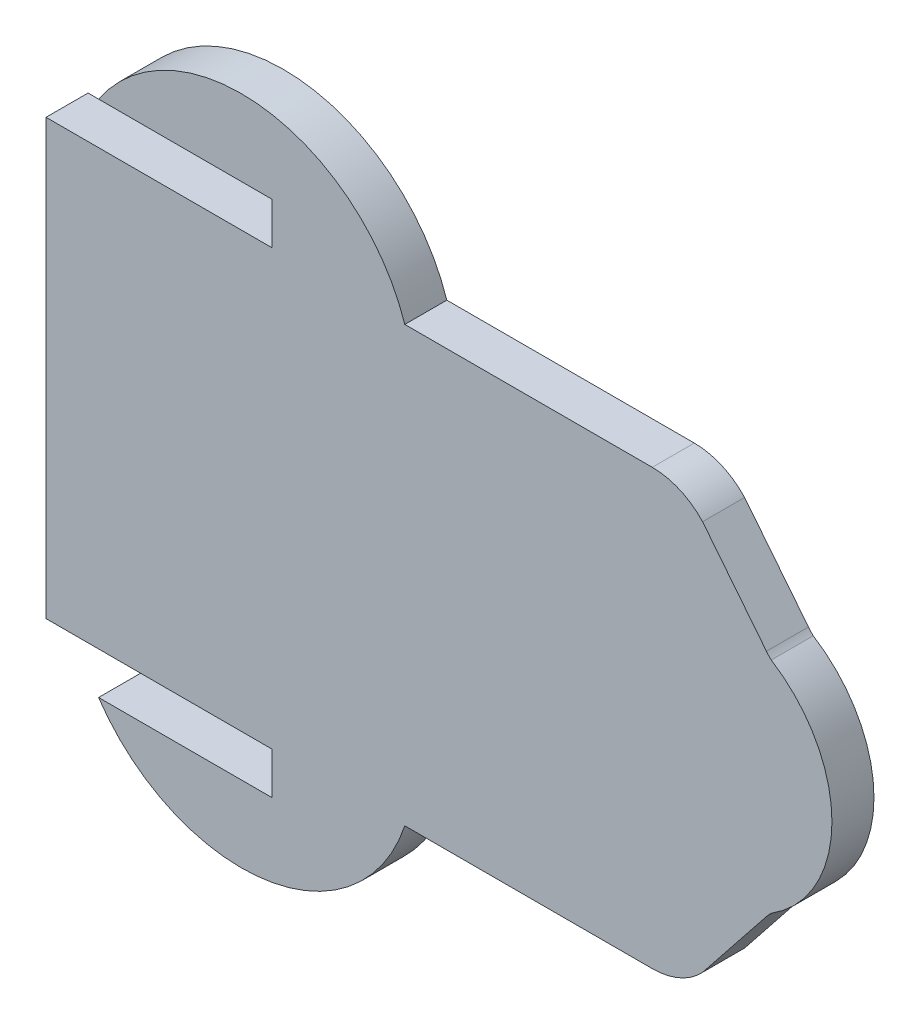
ISO-10303-21;
HEADER;
FILE_DESCRIPTION(('STEP AP214'),'2;1');
FILE_NAME('part.step','',(''),(''),'','','');
FILE_SCHEMA(('AUTOMOTIVE_DESIGN { 1 0 10303 214 1 1 1 1 }'));
ENDSEC;
DATA;
#1=APPLICATION_CONTEXT('core data for automotive mechanical design processes');
#2=APPLICATION_PROTOCOL_DEFINITION('international standard','automotive_design',2000,#1);
#3=PRODUCT_CONTEXT('',#1,'mechanical');
#4=PRODUCT('Part','Part','',(#3));
#5=PRODUCT_RELATED_PRODUCT_CATEGORY('part','',(#4));
#6=PRODUCT_DEFINITION_FORMATION('','',#4);
#7=PRODUCT_DEFINITION_CONTEXT('part definition',#1,'design');
#8=PRODUCT_DEFINITION('design','',#6,#7);
#9=PRODUCT_DEFINITION_SHAPE('','',#8);
#10=(LENGTH_UNIT() NAMED_UNIT(*) SI_UNIT(.MILLI.,.METRE.));
#11=(NAMED_UNIT(*) PLANE_ANGLE_UNIT() SI_UNIT($,.RADIAN.));
#12=(NAMED_UNIT(*) SI_UNIT($,.STERADIAN.) SOLID_ANGLE_UNIT());
#13=UNCERTAINTY_MEASURE_WITH_UNIT(LENGTH_MEASURE(1.E-05),#10,'distance_accuracy_value','');
#14=(GEOMETRIC_REPRESENTATION_CONTEXT(3) GLOBAL_UNCERTAINTY_ASSIGNED_CONTEXT((#13)) GLOBAL_UNIT_ASSIGNED_CONTEXT((#10,
#11,#12)) REPRESENTATION_CONTEXT('',''));
#15=CARTESIAN_POINT('',(0.,0.,0.));
#16=DIRECTION('',(0.,0.,1.));
#17=DIRECTION('',(1.,0.,0.));
#18=AXIS2_PLACEMENT_3D('',#15,#16,#17);
#19=CARTESIAN_POINT('',(548.457603782504,-25.5930810121583,3.));
#20=DIRECTION('',(0.,0.,-1.));
#21=DIRECTION('',(-1.,0.,0.));
#22=AXIS2_PLACEMENT_3D('',#19,#20,#21);
#23=CYLINDRICAL_SURFACE('',#22,12.280475130326);
#24=CARTESIAN_POINT('',(548.457603782504,-25.5930810121583,0.));
#25=DIRECTION('',(0.,0.,1.));
#26=DIRECTION('',(1.,0.,0.));
#27=AXIS2_PLACEMENT_3D('',#24,#25,#26);
#28=CIRCLE('',#27,12.280475130326);
#29=CARTESIAN_POINT('',(538.258588447794,-32.4334140178609,0.));
#30=VERTEX_POINT('',#29);
#31=CARTESIAN_POINT('',(560.122161718057,-29.4334140178611,0.));
#32=VERTEX_POINT('',#31);
#33=EDGE_CURVE('E160',#30,#32,#28,.T.);
#34=ORIENTED_EDGE('',*,*,#33,.T.);
#35=DIRECTION('',(0.,0.,-1.));
#36=VECTOR('',#35,1.);
#37=CARTESIAN_POINT('',(560.122161718057,-29.4334140178611,3.));
#38=LINE('',#37,#36);
#39=CARTESIAN_POINT('',(560.122161718057,-29.4334140178611,3.));
#40=VERTEX_POINT('',#39);
#41=EDGE_CURVE('E11',#40,#32,#38,.T.);
#42=ORIENTED_EDGE('',*,*,#41,.F.);
#43=CARTESIAN_POINT('',(548.457603782504,-25.5930810121583,3.));
#44=DIRECTION('',(0.,0.,1.));
#45=DIRECTION('',(1.,0.,0.));
#46=AXIS2_PLACEMENT_3D('',#43,#44,#45);
#47=CIRCLE('',#46,12.280475130326);
#48=CARTESIAN_POINT('',(538.258588447794,-32.4334140178609,3.));
#49=VERTEX_POINT('',#48);
#50=EDGE_CURVE('E208',#49,#40,#47,.T.);
#51=ORIENTED_EDGE('',*,*,#50,.F.);
#52=DIRECTION('',(0.,0.,-1.));
#53=VECTOR('',#52,1.);
#54=CARTESIAN_POINT('',(538.258588447794,-32.4334140178609,3.));
#55=LINE('',#54,#53);
#56=EDGE_CURVE('E173',#49,#30,#55,.T.);
#57=ORIENTED_EDGE('',*,*,#56,.T.);
#58=EDGE_LOOP('',(#34,#42,#51,#57));
#59=FACE_BOUND('',#58,.T.);
#60=ADVANCED_FACE('F32',(#59),#23,.T.);
#61=CARTESIAN_POINT('',(577.454155209327,-29.4334140178611,3.));
#62=DIRECTION('',(0.,1.,0.));
#63=DIRECTION('',(0.,0.,1.));
#64=AXIS2_PLACEMENT_3D('',#61,#62,#63);
#65=PLANE('',#64);
#66=DIRECTION('',(1.,0.,0.));
#67=VECTOR('',#66,1.);
#68=CARTESIAN_POINT('',(577.454155209327,-29.4334140178611,0.));
#69=LINE('',#68,#67);
#70=CARTESIAN_POINT('',(577.793445204686,-29.433414017861,0.));
#71=VERTEX_POINT('',#70);
#72=EDGE_CURVE('E156',#32,#71,#69,.T.);
#73=ORIENTED_EDGE('',*,*,#72,.T.);
#74=DIRECTION('',(0.,0.,-1.));
#75=VECTOR('',#74,1.);
#76=CARTESIAN_POINT('',(577.793445204686,-29.433414017861,3.));
#77=LINE('',#76,#75);
#78=CARTESIAN_POINT('',(577.793445204686,-29.433414017861,3.));
#79=VERTEX_POINT('',#78);
#80=EDGE_CURVE('E39',#79,#71,#77,.T.);
#81=ORIENTED_EDGE('',*,*,#80,.F.);
#82=DIRECTION('',(1.,0.,0.));
#83=VECTOR('',#82,1.);
#84=CARTESIAN_POINT('',(560.122161718057,-29.4334140178611,3.));
#85=LINE('',#84,#83);
#86=EDGE_CURVE('E169',#40,#79,#85,.T.);
#87=ORIENTED_EDGE('',*,*,#86,.F.);
#88=ORIENTED_EDGE('',*,*,#41,.T.);
#89=EDGE_LOOP('',(#73,#81,#87,#88));
#90=FACE_BOUND('',#89,.T.);
#91=ADVANCED_FACE('F168',(#90),#65,.F.);
#92=CARTESIAN_POINT('',(577.793445204687,-24.5375089611479,3.));
#93=DIRECTION('',(0.,0.,-1.));
#94=DIRECTION('',(-1.,0.,0.));
#95=AXIS2_PLACEMENT_3D('',#92,#93,#94);
#96=CYLINDRICAL_SURFACE('',#95,4.89590505671316);
#97=CARTESIAN_POINT('',(577.793445204687,-24.5375089611479,0.));
#98=DIRECTION('',(0.,0.,1.));
#99=DIRECTION('',(1.,0.,0.));
#100=AXIS2_PLACEMENT_3D('',#97,#98,#99);
#101=CIRCLE('',#100,4.89590505671316);
#102=CARTESIAN_POINT('',(581.383534896832,-27.8663439415432,0.));
#103=VERTEX_POINT('',#102);
#104=EDGE_CURVE('E162',#71,#103,#101,.T.);
#105=ORIENTED_EDGE('',*,*,#104,.T.);
#106=DIRECTION('',(0.,0.,-1.));
#107=VECTOR('',#106,1.);
#108=CARTESIAN_POINT('',(581.383534896832,-27.8663439415432,3.));
#109=LINE('',#108,#107);
#110=CARTESIAN_POINT('',(581.383534896832,-27.8663439415432,3.));
#111=VERTEX_POINT('',#110);
#112=EDGE_CURVE('E284',#111,#103,#109,.T.);
#113=ORIENTED_EDGE('',*,*,#112,.F.);
#114=CARTESIAN_POINT('',(577.793445204687,-24.5375089611479,3.));
#115=DIRECTION('',(0.,0.,1.));
#116=DIRECTION('',(1.,0.,0.));
#117=AXIS2_PLACEMENT_3D('',#114,#115,#116);
#118=CIRCLE('',#117,4.89590505671316);
#119=EDGE_CURVE('E211',#79,#111,#118,.T.);
#120=ORIENTED_EDGE('',*,*,#119,.F.);
#121=ORIENTED_EDGE('',*,*,#80,.T.);
#122=EDGE_LOOP('',(#105,#113,#120,#121));
#123=FACE_BOUND('',#122,.T.);
#124=ADVANCED_FACE('F288',(#123),#96,.T.);
#125=CARTESIAN_POINT('',(581.383534896832,-27.8663439415432,3.));
#126=DIRECTION('',(-0.782502216985626,0.622647798046841,0.));
#127=DIRECTION('',(-0.622647798046841,-0.782502216985627,0.));
#128=AXIS2_PLACEMENT_3D('',#125,#126,#127);
#129=PLANE('',#128);
#130=DIRECTION('',(0.622647798046841,0.782502216985627,0.));
#131=VECTOR('',#130,1.);
#132=CARTESIAN_POINT('',(581.383534896832,-27.8663439415432,0.));
#133=LINE('',#132,#131);
#134=CARTESIAN_POINT('',(585.943497104523,-22.1356876249514,0.));
#135=VERTEX_POINT('',#134);
#136=EDGE_CURVE('E177',#103,#135,#133,.T.);
#137=ORIENTED_EDGE('',*,*,#136,.T.);
#138=DIRECTION('',(0.,0.,-1.));
#139=VECTOR('',#138,1.);
#140=CARTESIAN_POINT('',(585.943497104523,-22.1356876249514,3.));
#141=LINE('',#140,#139);
#142=CARTESIAN_POINT('',(585.943497104523,-22.1356876249514,3.));
#143=VERTEX_POINT('',#142);
#144=EDGE_CURVE('E281',#143,#135,#141,.T.);
#145=ORIENTED_EDGE('',*,*,#144,.F.);
#146=DIRECTION('',(0.622647798046841,0.782502216985627,0.));
#147=VECTOR('',#146,1.);
#148=CARTESIAN_POINT('',(581.383534896832,-27.8663439415432,3.));
#149=LINE('',#148,#147);
#150=EDGE_CURVE('E213',#111,#143,#149,.T.);
#151=ORIENTED_EDGE('',*,*,#150,.F.);
#152=ORIENTED_EDGE('',*,*,#112,.T.);
#153=EDGE_LOOP('',(#137,#145,#151,#152));
#154=FACE_BOUND('',#153,.T.);
#155=ADVANCED_FACE('F296',(#154),#129,.F.);
#156=CARTESIAN_POINT('',(588.679966076687,-24.313133698529,3.));
#157=DIRECTION('',(0.,0.,-1.));
#158=DIRECTION('',(-1.,0.,0.));
#159=AXIS2_PLACEMENT_3D('',#156,#157,#158);
#160=CYLINDRICAL_SURFACE('',#159,3.49707504050936);
#161=CARTESIAN_POINT('',(588.679966076687,-24.313133698529,0.));
#162=DIRECTION('',(0.,0.,-1.));
#163=DIRECTION('',(1.,0.,0.));
#164=AXIS2_PLACEMENT_3D('',#161,#162,#163);
#165=CIRCLE('',#164,3.49707504050936);
#166=CARTESIAN_POINT('',(586.288300692801,-21.761767293938,0.));
#167=VERTEX_POINT('',#166);
#168=EDGE_CURVE('E179',#135,#167,#165,.T.);
#169=ORIENTED_EDGE('',*,*,#168,.T.);
#170=DIRECTION('',(0.,0.,-1.));
#171=VECTOR('',#170,1.);
#172=CARTESIAN_POINT('',(586.288300692801,-21.761767293938,3.));
#173=LINE('',#172,#171);
#174=CARTESIAN_POINT('',(586.288300692801,-21.761767293938,3.));
#175=VERTEX_POINT('',#174);
#176=EDGE_CURVE('E278',#175,#167,#173,.T.);
#177=ORIENTED_EDGE('',*,*,#176,.F.);
#178=CARTESIAN_POINT('',(588.679966076687,-24.313133698529,3.));
#179=DIRECTION('',(0.,0.,-1.));
#180=DIRECTION('',(1.,0.,0.));
#181=AXIS2_PLACEMENT_3D('',#178,#179,#180);
#182=CIRCLE('',#181,3.49707504050936);
#183=EDGE_CURVE('E215',#143,#175,#182,.T.);
#184=ORIENTED_EDGE('',*,*,#183,.F.);
#185=ORIENTED_EDGE('',*,*,#144,.T.);
#186=EDGE_LOOP('',(#169,#177,#184,#185));
#187=FACE_BOUND('',#186,.T.);
#188=ADVANCED_FACE('F299',(#187),#160,.F.);
#189=CARTESIAN_POINT('',(581.383534896832,-13.9334140178609,3.));
#190=DIRECTION('',(0.,0.,-1.));
#191=DIRECTION('',(-1.,0.,0.));
#192=AXIS2_PLACEMENT_3D('',#189,#190,#191);
#193=CYLINDRICAL_SURFACE('',#192,9.23795662083212);
#194=CARTESIAN_POINT('',(581.383534896832,-13.9334140178609,0.));
#195=DIRECTION('',(0.,0.,1.));
#196=DIRECTION('',(1.,0.,0.));
#197=AXIS2_PLACEMENT_3D('',#194,#195,#196);
#198=CIRCLE('',#197,9.23795662083212);
#199=CARTESIAN_POINT('',(586.288300692801,-6.10506074178385,0.));
#200=VERTEX_POINT('',#199);
#201=EDGE_CURVE('E181',#167,#200,#198,.T.);
#202=ORIENTED_EDGE('',*,*,#201,.T.);
#203=DIRECTION('',(0.,0.,-1.));
#204=VECTOR('',#203,1.);
#205=CARTESIAN_POINT('',(586.288300692801,-6.10506074178385,3.));
#206=LINE('',#205,#204);
#207=CARTESIAN_POINT('',(586.288300692801,-6.10506074178385,3.));
#208=VERTEX_POINT('',#207);
#209=EDGE_CURVE('E275',#208,#200,#206,.T.);
#210=ORIENTED_EDGE('',*,*,#209,.F.);
#211=CARTESIAN_POINT('',(581.383534896832,-13.9334140178609,3.));
#212=DIRECTION('',(0.,0.,1.));
#213=DIRECTION('',(1.,0.,0.));
#214=AXIS2_PLACEMENT_3D('',#211,#212,#213);
#215=CIRCLE('',#214,9.23795662083212);
#216=EDGE_CURVE('E217',#175,#208,#215,.T.);
#217=ORIENTED_EDGE('',*,*,#216,.F.);
#218=ORIENTED_EDGE('',*,*,#176,.T.);
#219=EDGE_LOOP('',(#202,#210,#217,#218));
#220=FACE_BOUND('',#219,.T.);
#221=ADVANCED_FACE('F304',(#220),#193,.T.);
#222=CARTESIAN_POINT('',(588.679966076687,-3.55369433719279,3.));
#223=DIRECTION('',(0.,0.,-1.));
#224=DIRECTION('',(-1.,0.,0.));
#225=AXIS2_PLACEMENT_3D('',#222,#223,#224);
#226=CYLINDRICAL_SURFACE('',#225,3.49707504050936);
#227=CARTESIAN_POINT('',(588.679966076687,-3.55369433719279,0.));
#228=DIRECTION('',(0.,0.,-1.));
#229=DIRECTION('',(-1.,0.,0.));
#230=AXIS2_PLACEMENT_3D('',#227,#228,#229);
#231=CIRCLE('',#230,3.49707504050936);
#232=CARTESIAN_POINT('',(585.943497104523,-5.73114041077043,0.));
#233=VERTEX_POINT('',#232);
#234=EDGE_CURVE('E183',#200,#233,#231,.T.);
#235=ORIENTED_EDGE('',*,*,#234,.T.);
#236=DIRECTION('',(0.,0.,-1.));
#237=VECTOR('',#236,1.);
#238=CARTESIAN_POINT('',(585.943497104523,-5.73114041077043,3.));
#239=LINE('',#238,#237);
#240=CARTESIAN_POINT('',(585.943497104523,-5.73114041077043,3.));
#241=VERTEX_POINT('',#240);
#242=EDGE_CURVE('E272',#241,#233,#239,.T.);
#243=ORIENTED_EDGE('',*,*,#242,.F.);
#244=CARTESIAN_POINT('',(588.679966076687,-3.55369433719279,3.));
#245=DIRECTION('',(0.,0.,-1.));
#246=DIRECTION('',(-1.,0.,0.));
#247=AXIS2_PLACEMENT_3D('',#244,#245,#246);
#248=CIRCLE('',#247,3.49707504050936);
#249=EDGE_CURVE('E219',#208,#241,#248,.T.);
#250=ORIENTED_EDGE('',*,*,#249,.F.);
#251=ORIENTED_EDGE('',*,*,#209,.T.);
#252=EDGE_LOOP('',(#235,#243,#250,#251));
#253=FACE_BOUND('',#252,.T.);
#254=ADVANCED_FACE('F310',(#253),#226,.F.);
#255=CARTESIAN_POINT('',(581.383534896832,-0.000484094178634757,3.));
#256=DIRECTION('',(-0.782502216985627,-0.622647798046841,0.));
#257=DIRECTION('',(0.622647798046841,-0.782502216985627,0.));
#258=AXIS2_PLACEMENT_3D('',#255,#256,#257);
#259=PLANE('',#258);
#260=DIRECTION('',(-0.622647798046841,0.782502216985627,0.));
#261=VECTOR('',#260,1.);
#262=CARTESIAN_POINT('',(581.383534896832,-0.000484094178634757,0.));
#263=LINE('',#262,#261);
#264=CARTESIAN_POINT('',(581.383534896832,-0.00048409417862565,0.));
#265=VERTEX_POINT('',#264);
#266=EDGE_CURVE('E185',#233,#265,#263,.T.);
#267=ORIENTED_EDGE('',*,*,#266,.T.);
#268=DIRECTION('',(0.,0.,-1.));
#269=VECTOR('',#268,1.);
#270=CARTESIAN_POINT('',(581.383534896832,-0.00048409417862565,3.));
#271=LINE('',#270,#269);
#272=CARTESIAN_POINT('',(581.383534896832,-0.00048409417862565,3.));
#273=VERTEX_POINT('',#272);
#274=EDGE_CURVE('E269',#273,#265,#271,.T.);
#275=ORIENTED_EDGE('',*,*,#274,.F.);
#276=DIRECTION('',(-0.622647798046841,0.782502216985627,0.));
#277=VECTOR('',#276,1.);
#278=CARTESIAN_POINT('',(581.383534896832,-0.000484094178634757,3.));
#279=LINE('',#278,#277);
#280=EDGE_CURVE('E221',#241,#273,#279,.T.);
#281=ORIENTED_EDGE('',*,*,#280,.F.);
#282=ORIENTED_EDGE('',*,*,#242,.T.);
#283=EDGE_LOOP('',(#267,#275,#281,#282));
#284=FACE_BOUND('',#283,.T.);
#285=ADVANCED_FACE('F314',(#284),#259,.F.);
#286=CARTESIAN_POINT('',(577.793445204687,-3.32931907457393,3.));
#287=DIRECTION('',(0.,0.,-1.));
#288=DIRECTION('',(-1.,0.,0.));
#289=AXIS2_PLACEMENT_3D('',#286,#287,#288);
#290=CYLINDRICAL_SURFACE('',#289,4.89590505671315);
#291=CARTESIAN_POINT('',(577.793445204687,-3.32931907457393,0.));
#292=DIRECTION('',(0.,0.,1.));
#293=DIRECTION('',(-1.,0.,0.));
#294=AXIS2_PLACEMENT_3D('',#291,#292,#293);
#295=CIRCLE('',#294,4.89590505671315);
#296=CARTESIAN_POINT('',(577.793445204686,1.56658598213923,0.));
#297=VERTEX_POINT('',#296);
#298=EDGE_CURVE('E187',#265,#297,#295,.T.);
#299=ORIENTED_EDGE('',*,*,#298,.T.);
#300=DIRECTION('',(0.,0.,-1.));
#301=VECTOR('',#300,1.);
#302=CARTESIAN_POINT('',(577.793445204686,1.56658598213923,3.));
#303=LINE('',#302,#301);
#304=CARTESIAN_POINT('',(577.793445204686,1.56658598213923,3.));
#305=VERTEX_POINT('',#304);
#306=EDGE_CURVE('E266',#305,#297,#303,.T.);
#307=ORIENTED_EDGE('',*,*,#306,.F.);
#308=CARTESIAN_POINT('',(577.793445204687,-3.32931907457393,3.));
#309=DIRECTION('',(0.,0.,1.));
#310=DIRECTION('',(-1.,0.,0.));
#311=AXIS2_PLACEMENT_3D('',#308,#309,#310);
#312=CIRCLE('',#311,4.89590505671315);
#313=EDGE_CURVE('E223',#273,#305,#312,.T.);
#314=ORIENTED_EDGE('',*,*,#313,.F.);
#315=ORIENTED_EDGE('',*,*,#274,.T.);
#316=EDGE_LOOP('',(#299,#307,#314,#315));
#317=FACE_BOUND('',#316,.T.);
#318=ADVANCED_FACE('F319',(#317),#290,.T.);
#319=CARTESIAN_POINT('',(560.122161718057,1.56658598213923,3.));
#320=DIRECTION('',(0.,-1.,0.));
#321=DIRECTION('',(0.,0.,-1.));
#322=AXIS2_PLACEMENT_3D('',#319,#320,#321);
#323=PLANE('',#322);
#324=DIRECTION('',(-1.,0.,0.));
#325=VECTOR('',#324,1.);
#326=CARTESIAN_POINT('',(560.122161718057,1.56658598213923,0.));
#327=LINE('',#326,#325);
#328=CARTESIAN_POINT('',(560.122161718057,1.56658598213924,0.));
#329=VERTEX_POINT('',#328);
#330=EDGE_CURVE('E190',#297,#329,#327,.T.);
#331=ORIENTED_EDGE('',*,*,#330,.T.);
#332=DIRECTION('',(0.,0.,-1.));
#333=VECTOR('',#332,1.);
#334=CARTESIAN_POINT('',(560.122161718057,1.56658598213924,3.));
#335=LINE('',#334,#333);
#336=CARTESIAN_POINT('',(560.122161718057,1.56658598213924,3.));
#337=VERTEX_POINT('',#336);
#338=EDGE_CURVE('E263',#337,#329,#335,.T.);
#339=ORIENTED_EDGE('',*,*,#338,.F.);
#340=DIRECTION('',(-1.,0.,0.));
#341=VECTOR('',#340,1.);
#342=CARTESIAN_POINT('',(577.454155209327,1.56658598213923,3.));
#343=LINE('',#342,#341);
#344=EDGE_CURVE('E225',#305,#337,#343,.T.);
#345=ORIENTED_EDGE('',*,*,#344,.F.);
#346=ORIENTED_EDGE('',*,*,#306,.T.);
#347=EDGE_LOOP('',(#331,#339,#345,#346));
#348=FACE_BOUND('',#347,.T.);
#349=ADVANCED_FACE('F325',(#348),#323,.F.);
#350=CARTESIAN_POINT('',(548.457603782504,-2.27374702356357,3.));
#351=DIRECTION('',(0.,0.,-1.));
#352=DIRECTION('',(-1.,0.,0.));
#353=AXIS2_PLACEMENT_3D('',#350,#351,#352);
#354=CYLINDRICAL_SURFACE('',#353,12.280475130326);
#355=CARTESIAN_POINT('',(548.457603782504,-2.27374702356357,0.));
#356=DIRECTION('',(0.,0.,1.));
#357=DIRECTION('',(-1.,0.,0.));
#358=AXIS2_PLACEMENT_3D('',#355,#356,#357);
#359=CIRCLE('',#358,12.280475130326);
#360=CARTESIAN_POINT('',(538.258588447794,4.56658598213909,0.));
#361=VERTEX_POINT('',#360);
#362=EDGE_CURVE('E192',#329,#361,#359,.T.);
#363=ORIENTED_EDGE('',*,*,#362,.T.);
#364=DIRECTION('',(0.,0.,-1.));
#365=VECTOR('',#364,1.);
#366=CARTESIAN_POINT('',(538.258588447794,4.56658598213909,3.));
#367=LINE('',#366,#365);
#368=CARTESIAN_POINT('',(538.258588447794,4.56658598213909,3.));
#369=VERTEX_POINT('',#368);
#370=EDGE_CURVE('E260',#369,#361,#367,.T.);
#371=ORIENTED_EDGE('',*,*,#370,.F.);
#372=CARTESIAN_POINT('',(548.457603782504,-2.27374702356357,3.));
#373=DIRECTION('',(0.,0.,1.));
#374=DIRECTION('',(-1.,0.,0.));
#375=AXIS2_PLACEMENT_3D('',#372,#373,#374);
#376=CIRCLE('',#375,12.280475130326);
#377=EDGE_CURVE('E227',#337,#369,#376,.T.);
#378=ORIENTED_EDGE('',*,*,#377,.F.);
#379=ORIENTED_EDGE('',*,*,#338,.T.);
#380=EDGE_LOOP('',(#363,#371,#378,#379));
#381=FACE_BOUND('',#380,.T.);
#382=ADVANCED_FACE('F328',(#381),#354,.T.);
#383=CARTESIAN_POINT('',(538.258588447794,4.56658598213909,3.));
#384=DIRECTION('',(0.,1.,0.));
#385=DIRECTION('',(0.,0.,1.));
#386=AXIS2_PLACEMENT_3D('',#383,#384,#385);
#387=PLANE('',#386);
#388=DIRECTION('',(1.,0.,0.));
#389=VECTOR('',#388,1.);
#390=CARTESIAN_POINT('',(538.258588447794,4.56658598213909,0.));
#391=LINE('',#390,#389);
#392=CARTESIAN_POINT('',(550.643129996254,4.56658598213909,0.));
#393=VERTEX_POINT('',#392);
#394=EDGE_CURVE('E194',#361,#393,#391,.T.);
#395=ORIENTED_EDGE('',*,*,#394,.T.);
#396=DIRECTION('',(0.,0.,-1.));
#397=VECTOR('',#396,1.);
#398=CARTESIAN_POINT('',(550.643129996254,4.56658598213909,3.));
#399=LINE('',#398,#397);
#400=CARTESIAN_POINT('',(550.643129996254,4.56658598213909,3.));
#401=VERTEX_POINT('',#400);
#402=EDGE_CURVE('E257',#401,#393,#399,.T.);
#403=ORIENTED_EDGE('',*,*,#402,.F.);
#404=DIRECTION('',(1.,0.,0.));
#405=VECTOR('',#404,1.);
#406=CARTESIAN_POINT('',(538.258588447794,4.56658598213909,3.));
#407=LINE('',#406,#405);
#408=EDGE_CURVE('E229',#369,#401,#407,.T.);
#409=ORIENTED_EDGE('',*,*,#408,.F.);
#410=ORIENTED_EDGE('',*,*,#370,.T.);
#411=EDGE_LOOP('',(#395,#403,#409,#410));
#412=FACE_BOUND('',#411,.T.);
#413=ADVANCED_FACE('F333',(#412),#387,.F.);
#414=CARTESIAN_POINT('',(550.643129996254,4.56658598213909,3.));
#415=DIRECTION('',(1.,0.,0.));
#416=DIRECTION('',(0.,0.,-1.));
#417=AXIS2_PLACEMENT_3D('',#414,#415,#416);
#418=PLANE('',#417);
#419=DIRECTION('',(0.,-1.,0.));
#420=VECTOR('',#419,1.);
#421=CARTESIAN_POINT('',(550.643129996254,4.56658598213909,0.));
#422=LINE('',#421,#420);
#423=CARTESIAN_POINT('',(550.643129996254,1.56658598213909,0.));
#424=VERTEX_POINT('',#423);
#425=EDGE_CURVE('E196',#393,#424,#422,.T.);
#426=ORIENTED_EDGE('',*,*,#425,.T.);
#427=DIRECTION('',(0.,0.,-1.));
#428=VECTOR('',#427,1.);
#429=CARTESIAN_POINT('',(550.643129996254,1.56658598213909,3.));
#430=LINE('',#429,#428);
#431=CARTESIAN_POINT('',(550.643129996254,1.56658598213909,3.));
#432=VERTEX_POINT('',#431);
#433=EDGE_CURVE('E254',#432,#424,#430,.T.);
#434=ORIENTED_EDGE('',*,*,#433,.F.);
#435=DIRECTION('',(0.,-1.,0.));
#436=VECTOR('',#435,1.);
#437=CARTESIAN_POINT('',(550.643129996254,4.56658598213909,3.));
#438=LINE('',#437,#436);
#439=EDGE_CURVE('E231',#401,#432,#438,.T.);
#440=ORIENTED_EDGE('',*,*,#439,.F.);
#441=ORIENTED_EDGE('',*,*,#402,.T.);
#442=EDGE_LOOP('',(#426,#434,#440,#441));
#443=FACE_BOUND('',#442,.T.);
#444=ADVANCED_FACE('F339',(#443),#418,.F.);
#445=CARTESIAN_POINT('',(534.507066227338,1.56658598213909,3.));
#446=DIRECTION('',(0.,-1.,0.));
#447=DIRECTION('',(0.,0.,-1.));
#448=AXIS2_PLACEMENT_3D('',#445,#446,#447);
#449=PLANE('',#448);
#450=DIRECTION('',(-1.,0.,0.));
#451=VECTOR('',#450,1.);
#452=CARTESIAN_POINT('',(534.507066227338,1.56658598213909,0.));
#453=LINE('',#452,#451);
#454=CARTESIAN_POINT('',(534.507066227338,1.56658598213909,0.));
#455=VERTEX_POINT('',#454);
#456=EDGE_CURVE('E198',#424,#455,#453,.T.);
#457=ORIENTED_EDGE('',*,*,#456,.T.);
#458=DIRECTION('',(0.,0.,-1.));
#459=VECTOR('',#458,1.);
#460=CARTESIAN_POINT('',(534.507066227338,1.56658598213909,3.));
#461=LINE('',#460,#459);
#462=CARTESIAN_POINT('',(534.507066227338,1.56658598213909,3.));
#463=VERTEX_POINT('',#462);
#464=EDGE_CURVE('E251',#463,#455,#461,.T.);
#465=ORIENTED_EDGE('',*,*,#464,.F.);
#466=DIRECTION('',(-1.,0.,0.));
#467=VECTOR('',#466,1.);
#468=CARTESIAN_POINT('',(534.507066227338,1.56658598213909,3.));
#469=LINE('',#468,#467);
#470=EDGE_CURVE('E233',#432,#463,#469,.T.);
#471=ORIENTED_EDGE('',*,*,#470,.F.);
#472=ORIENTED_EDGE('',*,*,#433,.T.);
#473=EDGE_LOOP('',(#457,#465,#471,#472));
#474=FACE_BOUND('',#473,.T.);
#475=ADVANCED_FACE('F343',(#474),#449,.F.);
#476=CARTESIAN_POINT('',(534.507066227338,1.56658598213909,3.));
#477=DIRECTION('',(1.,0.,0.));
#478=DIRECTION('',(0.,0.,-1.));
#479=AXIS2_PLACEMENT_3D('',#476,#477,#478);
#480=PLANE('',#479);
#481=DIRECTION('',(0.,-1.,0.));
#482=VECTOR('',#481,1.);
#483=CARTESIAN_POINT('',(534.507066227338,1.56658598213909,0.));
#484=LINE('',#483,#482);
#485=CARTESIAN_POINT('',(534.507066227338,-29.4334140178609,0.));
#486=VERTEX_POINT('',#485);
#487=EDGE_CURVE('E200',#455,#486,#484,.T.);
#488=ORIENTED_EDGE('',*,*,#487,.T.);
#489=DIRECTION('',(0.,0.,-1.));
#490=VECTOR('',#489,1.);
#491=CARTESIAN_POINT('',(534.507066227338,-29.4334140178609,3.));
#492=LINE('',#491,#490);
#493=CARTESIAN_POINT('',(534.507066227338,-29.4334140178609,3.));
#494=VERTEX_POINT('',#493);
#495=EDGE_CURVE('E248',#494,#486,#492,.T.);
#496=ORIENTED_EDGE('',*,*,#495,.F.);
#497=DIRECTION('',(0.,-1.,0.));
#498=VECTOR('',#497,1.);
#499=CARTESIAN_POINT('',(534.507066227338,1.56658598213909,3.));
#500=LINE('',#499,#498);
#501=EDGE_CURVE('E235',#463,#494,#500,.T.);
#502=ORIENTED_EDGE('',*,*,#501,.F.);
#503=ORIENTED_EDGE('',*,*,#464,.T.);
#504=EDGE_LOOP('',(#488,#496,#502,#503));
#505=FACE_BOUND('',#504,.T.);
#506=ADVANCED_FACE('F348',(#505),#480,.F.);
#507=CARTESIAN_POINT('',(534.507066227338,-29.4334140178609,3.));
#508=DIRECTION('',(0.,1.,0.));
#509=DIRECTION('',(0.,0.,1.));
#510=AXIS2_PLACEMENT_3D('',#507,#508,#509);
#511=PLANE('',#510);
#512=DIRECTION('',(1.,0.,0.));
#513=VECTOR('',#512,1.);
#514=CARTESIAN_POINT('',(534.507066227338,-29.4334140178609,0.));
#515=LINE('',#514,#513);
#516=CARTESIAN_POINT('',(550.643129996254,-29.4334140178609,0.));
#517=VERTEX_POINT('',#516);
#518=EDGE_CURVE('E202',#486,#517,#515,.T.);
#519=ORIENTED_EDGE('',*,*,#518,.T.);
#520=DIRECTION('',(0.,0.,-1.));
#521=VECTOR('',#520,1.);
#522=CARTESIAN_POINT('',(550.643129996254,-29.4334140178609,3.));
#523=LINE('',#522,#521);
#524=CARTESIAN_POINT('',(550.643129996254,-29.4334140178609,3.));
#525=VERTEX_POINT('',#524);
#526=EDGE_CURVE('E245',#525,#517,#523,.T.);
#527=ORIENTED_EDGE('',*,*,#526,.F.);
#528=DIRECTION('',(1.,0.,0.));
#529=VECTOR('',#528,1.);
#530=CARTESIAN_POINT('',(534.507066227338,-29.4334140178609,3.));
#531=LINE('',#530,#529);
#532=EDGE_CURVE('E237',#494,#525,#531,.T.);
#533=ORIENTED_EDGE('',*,*,#532,.F.);
#534=ORIENTED_EDGE('',*,*,#495,.T.);
#535=EDGE_LOOP('',(#519,#527,#533,#534));
#536=FACE_BOUND('',#535,.T.);
#537=ADVANCED_FACE('F352',(#536),#511,.F.);
#538=CARTESIAN_POINT('',(550.643129996254,-32.4334140178609,3.));
#539=DIRECTION('',(1.,0.,0.));
#540=DIRECTION('',(0.,0.,-1.));
#541=AXIS2_PLACEMENT_3D('',#538,#539,#540);
#542=PLANE('',#541);
#543=DIRECTION('',(0.,-1.,0.));
#544=VECTOR('',#543,1.);
#545=CARTESIAN_POINT('',(550.643129996254,-32.4334140178609,0.));
#546=LINE('',#545,#544);
#547=CARTESIAN_POINT('',(550.643129996254,-32.4334140178609,0.));
#548=VERTEX_POINT('',#547);
#549=EDGE_CURVE('E204',#517,#548,#546,.T.);
#550=ORIENTED_EDGE('',*,*,#549,.T.);
#551=DIRECTION('',(0.,0.,-1.));
#552=VECTOR('',#551,1.);
#553=CARTESIAN_POINT('',(550.643129996254,-32.4334140178609,3.));
#554=LINE('',#553,#552);
#555=CARTESIAN_POINT('',(550.643129996254,-32.4334140178609,3.));
#556=VERTEX_POINT('',#555);
#557=EDGE_CURVE('E242',#556,#548,#554,.T.);
#558=ORIENTED_EDGE('',*,*,#557,.F.);
#559=DIRECTION('',(0.,-1.,0.));
#560=VECTOR('',#559,1.);
#561=CARTESIAN_POINT('',(550.643129996254,-32.4334140178609,3.));
#562=LINE('',#561,#560);
#563=EDGE_CURVE('E51',#525,#556,#562,.T.);
#564=ORIENTED_EDGE('',*,*,#563,.F.);
#565=ORIENTED_EDGE('',*,*,#526,.T.);
#566=EDGE_LOOP('',(#550,#558,#564,#565));
#567=FACE_BOUND('',#566,.T.);
#568=ADVANCED_FACE('F356',(#567),#542,.F.);
#569=CARTESIAN_POINT('',(538.258588447794,-32.4334140178609,3.));
#570=DIRECTION('',(0.,-1.,0.));
#571=DIRECTION('',(0.,0.,-1.));
#572=AXIS2_PLACEMENT_3D('',#569,#570,#571);
#573=PLANE('',#572);
#574=DIRECTION('',(-1.,0.,0.));
#575=VECTOR('',#574,1.);
#576=CARTESIAN_POINT('',(538.258588447794,-32.4334140178609,0.));
#577=LINE('',#576,#575);
#578=EDGE_CURVE('E206',#548,#30,#577,.T.);
#579=ORIENTED_EDGE('',*,*,#578,.T.);
#580=ORIENTED_EDGE('',*,*,#56,.F.);
#581=DIRECTION('',(-1.,0.,0.));
#582=VECTOR('',#581,1.);
#583=CARTESIAN_POINT('',(538.258588447794,-32.4334140178609,3.));
#584=LINE('',#583,#582);
#585=EDGE_CURVE('E46',#556,#49,#584,.T.);
#586=ORIENTED_EDGE('',*,*,#585,.F.);
#587=ORIENTED_EDGE('',*,*,#557,.T.);
#588=EDGE_LOOP('',(#579,#580,#586,#587));
#589=FACE_BOUND('',#588,.T.);
#590=ADVANCED_FACE('F358',(#589),#573,.F.);
#591=CARTESIAN_POINT('',(548.457603782504,-25.5930810121583,3.));
#592=DIRECTION('',(0.,0.,1.));
#593=DIRECTION('',(1.,0.,0.));
#594=AXIS2_PLACEMENT_3D('',#591,#592,#593);
#595=PLANE('',#594);
#596=ORIENTED_EDGE('',*,*,#50,.T.);
#597=ORIENTED_EDGE('',*,*,#86,.T.);
#598=ORIENTED_EDGE('',*,*,#119,.T.);
#599=ORIENTED_EDGE('',*,*,#150,.T.);
#600=ORIENTED_EDGE('',*,*,#183,.T.);
#601=ORIENTED_EDGE('',*,*,#216,.T.);
#602=ORIENTED_EDGE('',*,*,#249,.T.);
#603=ORIENTED_EDGE('',*,*,#280,.T.);
#604=ORIENTED_EDGE('',*,*,#313,.T.);
#605=ORIENTED_EDGE('',*,*,#344,.T.);
#606=ORIENTED_EDGE('',*,*,#377,.T.);
#607=ORIENTED_EDGE('',*,*,#408,.T.);
#608=ORIENTED_EDGE('',*,*,#439,.T.);
#609=ORIENTED_EDGE('',*,*,#470,.T.);
#610=ORIENTED_EDGE('',*,*,#501,.T.);
#611=ORIENTED_EDGE('',*,*,#532,.T.);
#612=ORIENTED_EDGE('',*,*,#563,.T.);
#613=ORIENTED_EDGE('',*,*,#585,.T.);
#614=EDGE_LOOP('',(#596,#597,#598,#599,#600,#601,#602,#603,#604,#605,#606,#607,#608,#609,#610,
#611,#612,#613));
#615=FACE_BOUND('',#614,.T.);
#616=ADVANCED_FACE('F291',(#615),#595,.T.);
#617=CARTESIAN_POINT('',(548.457603782504,-25.5930810121583,0.));
#618=DIRECTION('',(0.,0.,1.));
#619=DIRECTION('',(1.,0.,0.));
#620=AXIS2_PLACEMENT_3D('',#617,#618,#619);
#621=PLANE('',#620);
#622=ORIENTED_EDGE('',*,*,#33,.F.);
#623=ORIENTED_EDGE('',*,*,#578,.F.);
#624=ORIENTED_EDGE('',*,*,#549,.F.);
#625=ORIENTED_EDGE('',*,*,#518,.F.);
#626=ORIENTED_EDGE('',*,*,#487,.F.);
#627=ORIENTED_EDGE('',*,*,#456,.F.);
#628=ORIENTED_EDGE('',*,*,#425,.F.);
#629=ORIENTED_EDGE('',*,*,#394,.F.);
#630=ORIENTED_EDGE('',*,*,#362,.F.);
#631=ORIENTED_EDGE('',*,*,#330,.F.);
#632=ORIENTED_EDGE('',*,*,#298,.F.);
#633=ORIENTED_EDGE('',*,*,#266,.F.);
#634=ORIENTED_EDGE('',*,*,#234,.F.);
#635=ORIENTED_EDGE('',*,*,#201,.F.);
#636=ORIENTED_EDGE('',*,*,#168,.F.);
#637=ORIENTED_EDGE('',*,*,#136,.F.);
#638=ORIENTED_EDGE('',*,*,#104,.F.);
#639=ORIENTED_EDGE('',*,*,#72,.F.);
#640=EDGE_LOOP('',(#622,#623,#624,#625,#626,#627,#628,#629,#630,#631,#632,#633,#634,#635,#636,
#637,#638,#639));
#641=FACE_BOUND('',#640,.T.);
#642=ADVANCED_FACE('F157',(#641),#621,.F.);
#643=CLOSED_SHELL('',(#60,#91,#124,#155,#188,#221,#254,#285,#318,#349,#382,#413,#444,#475,#506,
#537,#568,#590,#616,#642));
#644=MANIFOLD_SOLID_BREP('B2',#643);
#645=ADVANCED_BREP_SHAPE_REPRESENTATION('',(#18,#644),#14);
#646=SHAPE_DEFINITION_REPRESENTATION(#9,#645);
ENDSEC;
END-ISO-10303-21;
